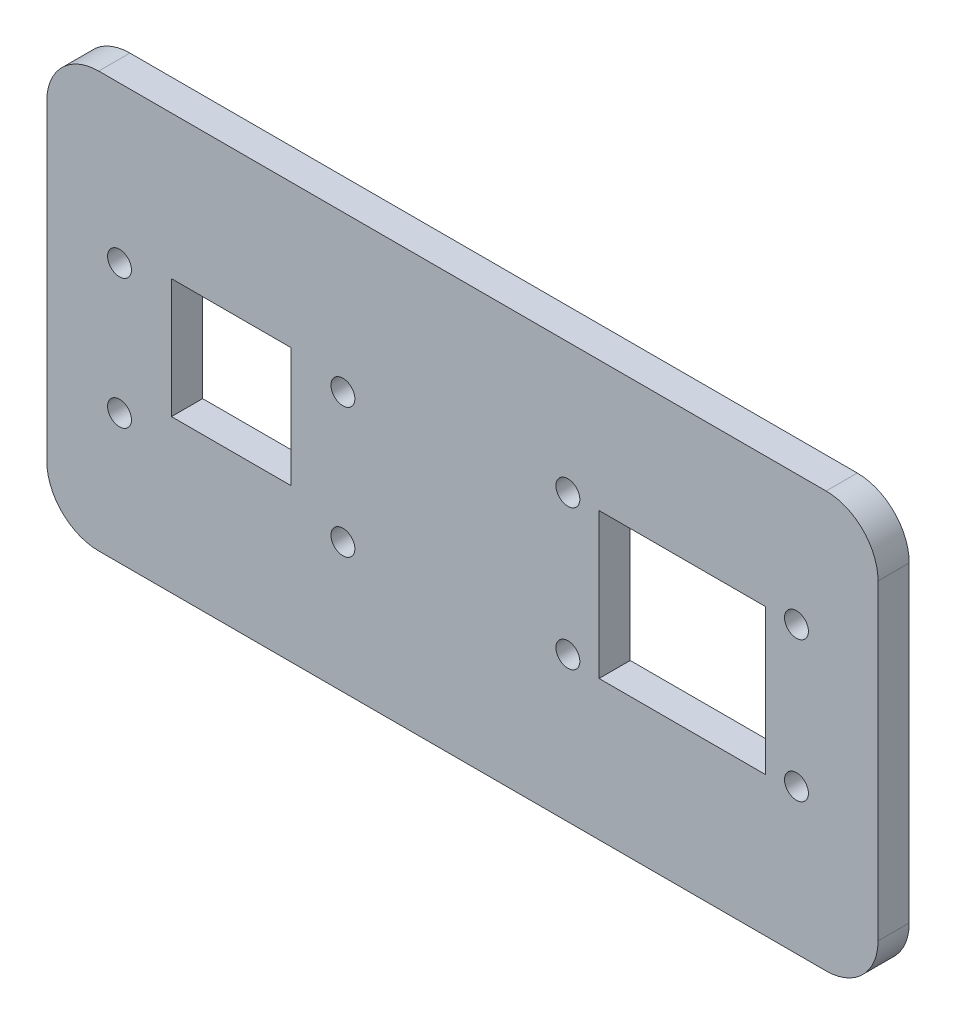
ISO-10303-21;
HEADER;
FILE_DESCRIPTION(('STEP AP214'),'2;1');
FILE_NAME('part.step','',(''),(''),'','','');
FILE_SCHEMA(('AUTOMOTIVE_DESIGN { 1 0 10303 214 1 1 1 1 }'));
ENDSEC;
DATA;
#1=APPLICATION_CONTEXT('core data for automotive mechanical design processes');
#2=APPLICATION_PROTOCOL_DEFINITION('international standard','automotive_design',2000,#1);
#3=PRODUCT_CONTEXT('',#1,'mechanical');
#4=PRODUCT('Part','Part','',(#3));
#5=PRODUCT_RELATED_PRODUCT_CATEGORY('part','',(#4));
#6=PRODUCT_DEFINITION_FORMATION('','',#4);
#7=PRODUCT_DEFINITION_CONTEXT('part definition',#1,'design');
#8=PRODUCT_DEFINITION('design','',#6,#7);
#9=PRODUCT_DEFINITION_SHAPE('','',#8);
#10=(LENGTH_UNIT() NAMED_UNIT(*) SI_UNIT(.MILLI.,.METRE.));
#11=(NAMED_UNIT(*) PLANE_ANGLE_UNIT() SI_UNIT($,.RADIAN.));
#12=(NAMED_UNIT(*) SI_UNIT($,.STERADIAN.) SOLID_ANGLE_UNIT());
#13=UNCERTAINTY_MEASURE_WITH_UNIT(LENGTH_MEASURE(1.E-05),#10,'distance_accuracy_value','');
#14=(GEOMETRIC_REPRESENTATION_CONTEXT(3) GLOBAL_UNCERTAINTY_ASSIGNED_CONTEXT((#13)) GLOBAL_UNIT_ASSIGNED_CONTEXT((#10,
#11,#12)) REPRESENTATION_CONTEXT('',''));
#15=CARTESIAN_POINT('',(0.,0.,0.));
#16=DIRECTION('',(0.,0.,1.));
#17=DIRECTION('',(1.,0.,0.));
#18=AXIS2_PLACEMENT_3D('',#15,#16,#17);
#19=CARTESIAN_POINT('',(0.,0.,3.));
#20=DIRECTION('',(0.,0.,1.));
#21=DIRECTION('',(1.,0.,0.));
#22=AXIS2_PLACEMENT_3D('',#19,#20,#21);
#23=PLANE('',#22);
#24=CARTESIAN_POINT('',(10.15,7.45000000000001,3.));
#25=DIRECTION('',(0.,0.,1.));
#26=DIRECTION('',(1.,0.,0.));
#27=AXIS2_PLACEMENT_3D('',#24,#25,#26);
#28=CIRCLE('',#27,1.15);
#29=CARTESIAN_POINT('',(11.3,7.45000000000001,3.));
#30=VERTEX_POINT('',#29);
#31=EDGE_CURVE('E598',#30,#30,#28,.T.);
#32=ORIENTED_EDGE('',*,*,#31,.F.);
#33=EDGE_LOOP('',(#32));
#34=FACE_BOUND('',#33,.T.);
#35=CARTESIAN_POINT('',(10.15,-6.04999999999999,3.));
#36=DIRECTION('',(0.,0.,1.));
#37=DIRECTION('',(1.,0.,0.));
#38=AXIS2_PLACEMENT_3D('',#35,#36,#37);
#39=CIRCLE('',#38,1.15);
#40=CARTESIAN_POINT('',(11.3,-6.04999999999999,3.));
#41=VERTEX_POINT('',#40);
#42=EDGE_CURVE('E606',#41,#41,#39,.T.);
#43=ORIENTED_EDGE('',*,*,#42,.F.);
#44=EDGE_LOOP('',(#43));
#45=FACE_BOUND('',#44,.T.);
#46=CARTESIAN_POINT('',(-33.,5.00000000000001,3.));
#47=DIRECTION('',(0.,0.,1.));
#48=DIRECTION('',(1.,0.,0.));
#49=AXIS2_PLACEMENT_3D('',#46,#47,#48);
#50=CIRCLE('',#49,1.15);
#51=CARTESIAN_POINT('',(-31.85,5.00000000000001,3.));
#52=VERTEX_POINT('',#51);
#53=EDGE_CURVE('E614',#52,#52,#50,.T.);
#54=ORIENTED_EDGE('',*,*,#53,.F.);
#55=EDGE_LOOP('',(#54));
#56=FACE_BOUND('',#55,.T.);
#57=CARTESIAN_POINT('',(-11.5,5.00000000000001,3.));
#58=DIRECTION('',(0.,0.,1.));
#59=DIRECTION('',(1.,0.,0.));
#60=AXIS2_PLACEMENT_3D('',#57,#58,#59);
#61=CIRCLE('',#60,1.15);
#62=CARTESIAN_POINT('',(-10.35,5.00000000000001,3.));
#63=VERTEX_POINT('',#62);
#64=EDGE_CURVE('E185',#63,#63,#61,.T.);
#65=ORIENTED_EDGE('',*,*,#64,.F.);
#66=EDGE_LOOP('',(#65));
#67=FACE_BOUND('',#66,.T.);
#68=DIRECTION('',(0.,1.,0.));
#69=VECTOR('',#68,1.);
#70=CARTESIAN_POINT('',(40.,20.,3.));
#71=LINE('',#70,#69);
#72=CARTESIAN_POINT('',(40.,-15.,3.));
#73=VERTEX_POINT('',#72);
#74=CARTESIAN_POINT('',(40.,15.,3.));
#75=VERTEX_POINT('',#74);
#76=EDGE_CURVE('E227',#73,#75,#71,.T.);
#77=ORIENTED_EDGE('',*,*,#76,.T.);
#78=CARTESIAN_POINT('',(35.,15.,3.));
#79=DIRECTION('',(0.,0.,1.));
#80=DIRECTION('',(1.,0.,0.));
#81=AXIS2_PLACEMENT_3D('',#78,#79,#80);
#82=CIRCLE('',#81,5.);
#83=CARTESIAN_POINT('',(35.,20.,3.));
#84=VERTEX_POINT('',#83);
#85=EDGE_CURVE('E270',#75,#84,#82,.T.);
#86=ORIENTED_EDGE('',*,*,#85,.T.);
#87=DIRECTION('',(-1.,0.,0.));
#88=VECTOR('',#87,1.);
#89=CARTESIAN_POINT('',(-40.,20.,3.));
#90=LINE('',#89,#88);
#91=CARTESIAN_POINT('',(-35.,20.,3.));
#92=VERTEX_POINT('',#91);
#93=EDGE_CURVE('E230',#84,#92,#90,.T.);
#94=ORIENTED_EDGE('',*,*,#93,.T.);
#95=CARTESIAN_POINT('',(-35.,15.,3.));
#96=DIRECTION('',(0.,0.,1.));
#97=DIRECTION('',(1.,0.,0.));
#98=AXIS2_PLACEMENT_3D('',#95,#96,#97);
#99=CIRCLE('',#98,5.);
#100=CARTESIAN_POINT('',(-40.,15.,3.));
#101=VERTEX_POINT('',#100);
#102=EDGE_CURVE('E265',#92,#101,#99,.T.);
#103=ORIENTED_EDGE('',*,*,#102,.T.);
#104=DIRECTION('',(0.,-1.,0.));
#105=VECTOR('',#104,1.);
#106=CARTESIAN_POINT('',(-40.,20.,3.));
#107=LINE('',#106,#105);
#108=CARTESIAN_POINT('',(-40.,-15.,3.));
#109=VERTEX_POINT('',#108);
#110=EDGE_CURVE('E234',#101,#109,#107,.T.);
#111=ORIENTED_EDGE('',*,*,#110,.T.);
#112=CARTESIAN_POINT('',(-35.,-15.,3.));
#113=DIRECTION('',(0.,0.,1.));
#114=DIRECTION('',(1.,0.,0.));
#115=AXIS2_PLACEMENT_3D('',#112,#113,#114);
#116=CIRCLE('',#115,5.);
#117=CARTESIAN_POINT('',(-35.,-20.,3.));
#118=VERTEX_POINT('',#117);
#119=EDGE_CURVE('E59',#109,#118,#116,.T.);
#120=ORIENTED_EDGE('',*,*,#119,.T.);
#121=DIRECTION('',(1.,0.,0.));
#122=VECTOR('',#121,1.);
#123=CARTESIAN_POINT('',(-40.,-20.,3.));
#124=LINE('',#123,#122);
#125=CARTESIAN_POINT('',(35.,-20.,3.));
#126=VERTEX_POINT('',#125);
#127=EDGE_CURVE('E236',#118,#126,#124,.T.);
#128=ORIENTED_EDGE('',*,*,#127,.T.);
#129=CARTESIAN_POINT('',(35.,-15.,3.));
#130=DIRECTION('',(0.,0.,1.));
#131=DIRECTION('',(1.,0.,0.));
#132=AXIS2_PLACEMENT_3D('',#129,#130,#131);
#133=CIRCLE('',#132,5.);
#134=EDGE_CURVE('E268',#126,#73,#133,.T.);
#135=ORIENTED_EDGE('',*,*,#134,.T.);
#136=EDGE_LOOP('',(#77,#86,#94,#103,#111,#120,#128,#135));
#137=FACE_BOUND('',#136,.T.);
#138=DIRECTION('',(-1.,0.,0.));
#139=VECTOR('',#138,1.);
#140=CARTESIAN_POINT('',(-28.,6.20000000000001,3.));
#141=LINE('',#140,#139);
#142=CARTESIAN_POINT('',(-16.5,6.20000000000001,3.));
#143=VERTEX_POINT('',#142);
#144=CARTESIAN_POINT('',(-28.,6.20000000000001,3.));
#145=VERTEX_POINT('',#144);
#146=EDGE_CURVE('E198',#143,#145,#141,.T.);
#147=ORIENTED_EDGE('',*,*,#146,.F.);
#148=DIRECTION('',(0.,1.,0.));
#149=VECTOR('',#148,1.);
#150=CARTESIAN_POINT('',(-16.5,6.20000000000001,3.));
#151=LINE('',#150,#149);
#152=CARTESIAN_POINT('',(-16.5,-5.29999999999999,3.));
#153=VERTEX_POINT('',#152);
#154=EDGE_CURVE('E196',#153,#143,#151,.T.);
#155=ORIENTED_EDGE('',*,*,#154,.F.);
#156=DIRECTION('',(1.,0.,0.));
#157=VECTOR('',#156,1.);
#158=CARTESIAN_POINT('',(-28.,-5.29999999999999,3.));
#159=LINE('',#158,#157);
#160=CARTESIAN_POINT('',(-28.,-5.29999999999999,3.));
#161=VERTEX_POINT('',#160);
#162=EDGE_CURVE('E204',#161,#153,#159,.T.);
#163=ORIENTED_EDGE('',*,*,#162,.F.);
#164=DIRECTION('',(0.,-1.,0.));
#165=VECTOR('',#164,1.);
#166=CARTESIAN_POINT('',(-28.,6.20000000000001,3.));
#167=LINE('',#166,#165);
#168=EDGE_CURVE('E201',#145,#161,#167,.T.);
#169=ORIENTED_EDGE('',*,*,#168,.F.);
#170=EDGE_LOOP('',(#147,#155,#163,#169));
#171=FACE_BOUND('',#170,.T.);
#172=DIRECTION('',(-1.,0.,0.));
#173=VECTOR('',#172,1.);
#174=CARTESIAN_POINT('',(13.15,7.45000000000001,3.));
#175=LINE('',#174,#173);
#176=CARTESIAN_POINT('',(29.15,7.45000000000001,3.));
#177=VERTEX_POINT('',#176);
#178=CARTESIAN_POINT('',(13.15,7.45000000000001,3.));
#179=VERTEX_POINT('',#178);
#180=EDGE_CURVE('E162',#177,#179,#175,.T.);
#181=ORIENTED_EDGE('',*,*,#180,.F.);
#182=DIRECTION('',(0.,1.,0.));
#183=VECTOR('',#182,1.);
#184=CARTESIAN_POINT('',(29.15,7.45000000000001,3.));
#185=LINE('',#184,#183);
#186=CARTESIAN_POINT('',(29.15,-6.54999999999999,3.));
#187=VERTEX_POINT('',#186);
#188=EDGE_CURVE('E152',#187,#177,#185,.T.);
#189=ORIENTED_EDGE('',*,*,#188,.F.);
#190=DIRECTION('',(1.,0.,0.));
#191=VECTOR('',#190,1.);
#192=CARTESIAN_POINT('',(13.15,-6.54999999999999,3.));
#193=LINE('',#192,#191);
#194=CARTESIAN_POINT('',(13.15,-6.54999999999999,3.));
#195=VERTEX_POINT('',#194);
#196=EDGE_CURVE('E178',#195,#187,#193,.T.);
#197=ORIENTED_EDGE('',*,*,#196,.F.);
#198=DIRECTION('',(0.,-1.,0.));
#199=VECTOR('',#198,1.);
#200=CARTESIAN_POINT('',(13.15,7.45000000000001,3.));
#201=LINE('',#200,#199);
#202=EDGE_CURVE('E176',#179,#195,#201,.T.);
#203=ORIENTED_EDGE('',*,*,#202,.F.);
#204=EDGE_LOOP('',(#181,#189,#197,#203));
#205=FACE_BOUND('',#204,.T.);
#206=CARTESIAN_POINT('',(-11.5,-7.49999999999999,3.));
#207=DIRECTION('',(0.,0.,1.));
#208=DIRECTION('',(1.,0.,0.));
#209=AXIS2_PLACEMENT_3D('',#206,#207,#208);
#210=CIRCLE('',#209,1.15);
#211=CARTESIAN_POINT('',(-10.35,-7.49999999999999,3.));
#212=VERTEX_POINT('',#211);
#213=EDGE_CURVE('E618',#212,#212,#210,.T.);
#214=ORIENTED_EDGE('',*,*,#213,.F.);
#215=EDGE_LOOP('',(#214));
#216=FACE_BOUND('',#215,.T.);
#217=CARTESIAN_POINT('',(-33.,-7.49999999999999,3.));
#218=DIRECTION('',(0.,0.,1.));
#219=DIRECTION('',(1.,0.,0.));
#220=AXIS2_PLACEMENT_3D('',#217,#218,#219);
#221=CIRCLE('',#220,1.15);
#222=CARTESIAN_POINT('',(-31.85,-7.49999999999999,3.));
#223=VERTEX_POINT('',#222);
#224=EDGE_CURVE('E610',#223,#223,#221,.T.);
#225=ORIENTED_EDGE('',*,*,#224,.F.);
#226=EDGE_LOOP('',(#225));
#227=FACE_BOUND('',#226,.T.);
#228=CARTESIAN_POINT('',(32.15,7.45000000000001,3.));
#229=DIRECTION('',(0.,0.,1.));
#230=DIRECTION('',(1.,0.,0.));
#231=AXIS2_PLACEMENT_3D('',#228,#229,#230);
#232=CIRCLE('',#231,1.15);
#233=CARTESIAN_POINT('',(33.3,7.45000000000001,3.));
#234=VERTEX_POINT('',#233);
#235=EDGE_CURVE('E602',#234,#234,#232,.T.);
#236=ORIENTED_EDGE('',*,*,#235,.F.);
#237=EDGE_LOOP('',(#236));
#238=FACE_BOUND('',#237,.T.);
#239=CARTESIAN_POINT('',(32.15,-6.04999999999999,3.));
#240=DIRECTION('',(0.,0.,1.));
#241=DIRECTION('',(1.,0.,0.));
#242=AXIS2_PLACEMENT_3D('',#239,#240,#241);
#243=CIRCLE('',#242,1.15);
#244=CARTESIAN_POINT('',(33.3,-6.04999999999999,3.));
#245=VERTEX_POINT('',#244);
#246=EDGE_CURVE('E593',#245,#245,#243,.T.);
#247=ORIENTED_EDGE('',*,*,#246,.F.);
#248=EDGE_LOOP('',(#247));
#249=FACE_BOUND('',#248,.T.);
#250=ADVANCED_FACE('F37',(#34,#45,#56,#67,#137,#171,#205,#216,#227,#238,#249),#23,.T.);
#251=CARTESIAN_POINT('',(0.,0.,0.));
#252=DIRECTION('',(0.,0.,1.));
#253=DIRECTION('',(1.,0.,0.));
#254=AXIS2_PLACEMENT_3D('',#251,#252,#253);
#255=PLANE('',#254);
#256=DIRECTION('',(0.,1.,0.));
#257=VECTOR('',#256,1.);
#258=CARTESIAN_POINT('',(-16.5,6.20000000000001,0.));
#259=LINE('',#258,#257);
#260=CARTESIAN_POINT('',(-16.5,-5.29999999999999,0.));
#261=VERTEX_POINT('',#260);
#262=CARTESIAN_POINT('',(-16.5,6.20000000000001,0.));
#263=VERTEX_POINT('',#262);
#264=EDGE_CURVE('E170',#261,#263,#259,.T.);
#265=ORIENTED_EDGE('',*,*,#264,.T.);
#266=DIRECTION('',(-1.,0.,0.));
#267=VECTOR('',#266,1.);
#268=CARTESIAN_POINT('',(-28.,6.20000000000001,0.));
#269=LINE('',#268,#267);
#270=CARTESIAN_POINT('',(-28.,6.20000000000001,0.));
#271=VERTEX_POINT('',#270);
#272=EDGE_CURVE('E209',#263,#271,#269,.T.);
#273=ORIENTED_EDGE('',*,*,#272,.T.);
#274=DIRECTION('',(0.,-1.,0.));
#275=VECTOR('',#274,1.);
#276=CARTESIAN_POINT('',(-28.,6.20000000000001,0.));
#277=LINE('',#276,#275);
#278=CARTESIAN_POINT('',(-28.,-5.29999999999999,0.));
#279=VERTEX_POINT('',#278);
#280=EDGE_CURVE('E212',#271,#279,#277,.T.);
#281=ORIENTED_EDGE('',*,*,#280,.T.);
#282=DIRECTION('',(1.,0.,0.));
#283=VECTOR('',#282,1.);
#284=CARTESIAN_POINT('',(-28.,-5.29999999999999,0.));
#285=LINE('',#284,#283);
#286=EDGE_CURVE('E199',#279,#261,#285,.T.);
#287=ORIENTED_EDGE('',*,*,#286,.T.);
#288=EDGE_LOOP('',(#265,#273,#281,#287));
#289=FACE_BOUND('',#288,.T.);
#290=DIRECTION('',(-1.,0.,0.));
#291=VECTOR('',#290,1.);
#292=CARTESIAN_POINT('',(-40.,20.,0.));
#293=LINE('',#292,#291);
#294=CARTESIAN_POINT('',(35.,20.,0.));
#295=VERTEX_POINT('',#294);
#296=CARTESIAN_POINT('',(-35.,20.,0.));
#297=VERTEX_POINT('',#296);
#298=EDGE_CURVE('E241',#295,#297,#293,.T.);
#299=ORIENTED_EDGE('',*,*,#298,.F.);
#300=CARTESIAN_POINT('',(35.,15.,0.));
#301=DIRECTION('',(0.,0.,1.));
#302=DIRECTION('',(1.,0.,0.));
#303=AXIS2_PLACEMENT_3D('',#300,#301,#302);
#304=CIRCLE('',#303,5.);
#305=CARTESIAN_POINT('',(40.,15.,0.));
#306=VERTEX_POINT('',#305);
#307=EDGE_CURVE('E258',#295,#306,#304,.F.);
#308=ORIENTED_EDGE('',*,*,#307,.T.);
#309=DIRECTION('',(0.,1.,0.));
#310=VECTOR('',#309,1.);
#311=CARTESIAN_POINT('',(40.,20.,0.));
#312=LINE('',#311,#310);
#313=CARTESIAN_POINT('',(40.,-15.,0.));
#314=VERTEX_POINT('',#313);
#315=EDGE_CURVE('E226',#314,#306,#312,.T.);
#316=ORIENTED_EDGE('',*,*,#315,.F.);
#317=CARTESIAN_POINT('',(35.,-15.,0.));
#318=DIRECTION('',(0.,0.,1.));
#319=DIRECTION('',(1.,0.,0.));
#320=AXIS2_PLACEMENT_3D('',#317,#318,#319);
#321=CIRCLE('',#320,5.);
#322=CARTESIAN_POINT('',(35.,-20.,0.));
#323=VERTEX_POINT('',#322);
#324=EDGE_CURVE('E256',#314,#323,#321,.F.);
#325=ORIENTED_EDGE('',*,*,#324,.T.);
#326=DIRECTION('',(1.,0.,0.));
#327=VECTOR('',#326,1.);
#328=CARTESIAN_POINT('',(-40.,-20.,0.));
#329=LINE('',#328,#327);
#330=CARTESIAN_POINT('',(-35.,-20.,0.));
#331=VERTEX_POINT('',#330);
#332=EDGE_CURVE('E231',#331,#323,#329,.T.);
#333=ORIENTED_EDGE('',*,*,#332,.F.);
#334=CARTESIAN_POINT('',(-35.,-15.,0.));
#335=DIRECTION('',(0.,0.,1.));
#336=DIRECTION('',(1.,0.,0.));
#337=AXIS2_PLACEMENT_3D('',#334,#335,#336);
#338=CIRCLE('',#337,5.);
#339=CARTESIAN_POINT('',(-40.,-15.,0.));
#340=VERTEX_POINT('',#339);
#341=EDGE_CURVE('E254',#331,#340,#338,.F.);
#342=ORIENTED_EDGE('',*,*,#341,.T.);
#343=DIRECTION('',(0.,-1.,0.));
#344=VECTOR('',#343,1.);
#345=CARTESIAN_POINT('',(-40.,20.,0.));
#346=LINE('',#345,#344);
#347=CARTESIAN_POINT('',(-40.,15.,0.));
#348=VERTEX_POINT('',#347);
#349=EDGE_CURVE('E244',#348,#340,#346,.T.);
#350=ORIENTED_EDGE('',*,*,#349,.F.);
#351=CARTESIAN_POINT('',(-35.,15.,0.));
#352=DIRECTION('',(0.,0.,1.));
#353=DIRECTION('',(1.,0.,0.));
#354=AXIS2_PLACEMENT_3D('',#351,#352,#353);
#355=CIRCLE('',#354,5.);
#356=EDGE_CURVE('E252',#348,#297,#355,.F.);
#357=ORIENTED_EDGE('',*,*,#356,.T.);
#358=EDGE_LOOP('',(#299,#308,#316,#325,#333,#342,#350,#357));
#359=FACE_BOUND('',#358,.T.);
#360=DIRECTION('',(0.,1.,0.));
#361=VECTOR('',#360,1.);
#362=CARTESIAN_POINT('',(29.15,7.45000000000001,0.));
#363=LINE('',#362,#361);
#364=CARTESIAN_POINT('',(29.15,-6.54999999999999,0.));
#365=VERTEX_POINT('',#364);
#366=CARTESIAN_POINT('',(29.15,7.45000000000001,0.));
#367=VERTEX_POINT('',#366);
#368=EDGE_CURVE('E183',#365,#367,#363,.T.);
#369=ORIENTED_EDGE('',*,*,#368,.T.);
#370=DIRECTION('',(-1.,0.,0.));
#371=VECTOR('',#370,1.);
#372=CARTESIAN_POINT('',(13.15,7.45000000000001,0.));
#373=LINE('',#372,#371);
#374=CARTESIAN_POINT('',(13.15,7.45000000000001,0.));
#375=VERTEX_POINT('',#374);
#376=EDGE_CURVE('E169',#367,#375,#373,.T.);
#377=ORIENTED_EDGE('',*,*,#376,.T.);
#378=DIRECTION('',(0.,-1.,0.));
#379=VECTOR('',#378,1.);
#380=CARTESIAN_POINT('',(13.15,7.45000000000001,0.));
#381=LINE('',#380,#379);
#382=CARTESIAN_POINT('',(13.15,-6.54999999999999,0.));
#383=VERTEX_POINT('',#382);
#384=EDGE_CURVE('E187',#375,#383,#381,.T.);
#385=ORIENTED_EDGE('',*,*,#384,.T.);
#386=DIRECTION('',(1.,0.,0.));
#387=VECTOR('',#386,1.);
#388=CARTESIAN_POINT('',(13.15,-6.54999999999999,0.));
#389=LINE('',#388,#387);
#390=EDGE_CURVE('E163',#383,#365,#389,.T.);
#391=ORIENTED_EDGE('',*,*,#390,.T.);
#392=EDGE_LOOP('',(#369,#377,#385,#391));
#393=FACE_BOUND('',#392,.T.);
#394=CARTESIAN_POINT('',(-11.5,5.00000000000001,0.));
#395=DIRECTION('',(0.,0.,1.));
#396=DIRECTION('',(1.,0.,0.));
#397=AXIS2_PLACEMENT_3D('',#394,#395,#396);
#398=CIRCLE('',#397,1.15);
#399=CARTESIAN_POINT('',(-10.35,5.00000000000001,0.));
#400=VERTEX_POINT('',#399);
#401=EDGE_CURVE('E564',#400,#400,#398,.T.);
#402=ORIENTED_EDGE('',*,*,#401,.T.);
#403=EDGE_LOOP('',(#402));
#404=FACE_BOUND('',#403,.T.);
#405=CARTESIAN_POINT('',(-11.5,-7.49999999999999,0.));
#406=DIRECTION('',(0.,0.,1.));
#407=DIRECTION('',(1.,0.,0.));
#408=AXIS2_PLACEMENT_3D('',#405,#406,#407);
#409=CIRCLE('',#408,1.15);
#410=CARTESIAN_POINT('',(-10.35,-7.49999999999999,0.));
#411=VERTEX_POINT('',#410);
#412=EDGE_CURVE('E568',#411,#411,#409,.T.);
#413=ORIENTED_EDGE('',*,*,#412,.T.);
#414=EDGE_LOOP('',(#413));
#415=FACE_BOUND('',#414,.T.);
#416=CARTESIAN_POINT('',(-33.,5.00000000000001,0.));
#417=DIRECTION('',(0.,0.,1.));
#418=DIRECTION('',(1.,0.,0.));
#419=AXIS2_PLACEMENT_3D('',#416,#417,#418);
#420=CIRCLE('',#419,1.15);
#421=CARTESIAN_POINT('',(-31.85,5.00000000000001,0.));
#422=VERTEX_POINT('',#421);
#423=EDGE_CURVE('E572',#422,#422,#420,.T.);
#424=ORIENTED_EDGE('',*,*,#423,.T.);
#425=EDGE_LOOP('',(#424));
#426=FACE_BOUND('',#425,.T.);
#427=CARTESIAN_POINT('',(-33.,-7.49999999999999,0.));
#428=DIRECTION('',(0.,0.,1.));
#429=DIRECTION('',(1.,0.,0.));
#430=AXIS2_PLACEMENT_3D('',#427,#428,#429);
#431=CIRCLE('',#430,1.15);
#432=CARTESIAN_POINT('',(-31.85,-7.49999999999999,0.));
#433=VERTEX_POINT('',#432);
#434=EDGE_CURVE('E576',#433,#433,#431,.T.);
#435=ORIENTED_EDGE('',*,*,#434,.T.);
#436=EDGE_LOOP('',(#435));
#437=FACE_BOUND('',#436,.T.);
#438=CARTESIAN_POINT('',(10.15,-6.04999999999999,0.));
#439=DIRECTION('',(0.,0.,1.));
#440=DIRECTION('',(1.,0.,0.));
#441=AXIS2_PLACEMENT_3D('',#438,#439,#440);
#442=CIRCLE('',#441,1.15);
#443=CARTESIAN_POINT('',(11.3,-6.04999999999999,0.));
#444=VERTEX_POINT('',#443);
#445=EDGE_CURVE('E580',#444,#444,#442,.T.);
#446=ORIENTED_EDGE('',*,*,#445,.T.);
#447=EDGE_LOOP('',(#446));
#448=FACE_BOUND('',#447,.T.);
#449=CARTESIAN_POINT('',(32.15,7.45000000000001,0.));
#450=DIRECTION('',(0.,0.,1.));
#451=DIRECTION('',(1.,0.,0.));
#452=AXIS2_PLACEMENT_3D('',#449,#450,#451);
#453=CIRCLE('',#452,1.15);
#454=CARTESIAN_POINT('',(33.3,7.45000000000001,0.));
#455=VERTEX_POINT('',#454);
#456=EDGE_CURVE('E584',#455,#455,#453,.T.);
#457=ORIENTED_EDGE('',*,*,#456,.T.);
#458=EDGE_LOOP('',(#457));
#459=FACE_BOUND('',#458,.T.);
#460=CARTESIAN_POINT('',(10.15,7.45000000000001,0.));
#461=DIRECTION('',(0.,0.,1.));
#462=DIRECTION('',(1.,0.,0.));
#463=AXIS2_PLACEMENT_3D('',#460,#461,#462);
#464=CIRCLE('',#463,1.15);
#465=CARTESIAN_POINT('',(11.3,7.45000000000001,0.));
#466=VERTEX_POINT('',#465);
#467=EDGE_CURVE('E588',#466,#466,#464,.T.);
#468=ORIENTED_EDGE('',*,*,#467,.T.);
#469=EDGE_LOOP('',(#468));
#470=FACE_BOUND('',#469,.T.);
#471=CARTESIAN_POINT('',(32.15,-6.04999999999999,0.));
#472=DIRECTION('',(0.,0.,1.));
#473=DIRECTION('',(1.,0.,0.));
#474=AXIS2_PLACEMENT_3D('',#471,#472,#473);
#475=CIRCLE('',#474,1.15);
#476=CARTESIAN_POINT('',(33.3,-6.04999999999999,0.));
#477=VERTEX_POINT('',#476);
#478=EDGE_CURVE('E591',#477,#477,#475,.T.);
#479=ORIENTED_EDGE('',*,*,#478,.T.);
#480=EDGE_LOOP('',(#479));
#481=FACE_BOUND('',#480,.T.);
#482=ADVANCED_FACE('F286',(#289,#359,#393,#404,#415,#426,#437,#448,#459,#470,#481),#255,.F.);
#483=CARTESIAN_POINT('',(40.,20.,3.));
#484=DIRECTION('',(-1.,0.,0.));
#485=DIRECTION('',(0.,-1.,0.));
#486=AXIS2_PLACEMENT_3D('',#483,#484,#485);
#487=PLANE('',#486);
#488=ORIENTED_EDGE('',*,*,#315,.T.);
#489=DIRECTION('',(0.,0.,-1.));
#490=VECTOR('',#489,1.);
#491=CARTESIAN_POINT('',(40.,15.,3.));
#492=LINE('',#491,#490);
#493=EDGE_CURVE('E263',#306,#75,#492,.F.);
#494=ORIENTED_EDGE('',*,*,#493,.T.);
#495=ORIENTED_EDGE('',*,*,#76,.F.);
#496=DIRECTION('',(0.,0.,-1.));
#497=VECTOR('',#496,1.);
#498=CARTESIAN_POINT('',(40.,-15.,3.));
#499=LINE('',#498,#497);
#500=EDGE_CURVE('E260',#73,#314,#499,.T.);
#501=ORIENTED_EDGE('',*,*,#500,.T.);
#502=EDGE_LOOP('',(#488,#494,#495,#501));
#503=FACE_BOUND('',#502,.T.);
#504=ADVANCED_FACE('F301',(#503),#487,.F.);
#505=CARTESIAN_POINT('',(-40.,20.,3.));
#506=DIRECTION('',(0.,-1.,0.));
#507=DIRECTION('',(0.,0.,-1.));
#508=AXIS2_PLACEMENT_3D('',#505,#506,#507);
#509=PLANE('',#508);
#510=ORIENTED_EDGE('',*,*,#93,.F.);
#511=DIRECTION('',(0.,0.,-1.));
#512=VECTOR('',#511,1.);
#513=CARTESIAN_POINT('',(35.,20.,3.));
#514=LINE('',#513,#512);
#515=EDGE_CURVE('E249',#84,#295,#514,.T.);
#516=ORIENTED_EDGE('',*,*,#515,.T.);
#517=ORIENTED_EDGE('',*,*,#298,.T.);
#518=DIRECTION('',(0.,0.,-1.));
#519=VECTOR('',#518,1.);
#520=CARTESIAN_POINT('',(-35.,20.,3.));
#521=LINE('',#520,#519);
#522=EDGE_CURVE('E238',#297,#92,#521,.F.);
#523=ORIENTED_EDGE('',*,*,#522,.T.);
#524=EDGE_LOOP('',(#510,#516,#517,#523));
#525=FACE_BOUND('',#524,.T.);
#526=ADVANCED_FACE('F309',(#525),#509,.F.);
#527=CARTESIAN_POINT('',(-40.,20.,3.));
#528=DIRECTION('',(1.,0.,0.));
#529=DIRECTION('',(0.,1.,0.));
#530=AXIS2_PLACEMENT_3D('',#527,#528,#529);
#531=PLANE('',#530);
#532=ORIENTED_EDGE('',*,*,#349,.T.);
#533=DIRECTION('',(0.,0.,-1.));
#534=VECTOR('',#533,1.);
#535=CARTESIAN_POINT('',(-40.,-15.,3.));
#536=LINE('',#535,#534);
#537=EDGE_CURVE('E11',#340,#109,#536,.F.);
#538=ORIENTED_EDGE('',*,*,#537,.T.);
#539=ORIENTED_EDGE('',*,*,#110,.F.);
#540=DIRECTION('',(0.,0.,-1.));
#541=VECTOR('',#540,1.);
#542=CARTESIAN_POINT('',(-40.,15.,3.));
#543=LINE('',#542,#541);
#544=EDGE_CURVE('E45',#101,#348,#543,.T.);
#545=ORIENTED_EDGE('',*,*,#544,.T.);
#546=EDGE_LOOP('',(#532,#538,#539,#545));
#547=FACE_BOUND('',#546,.T.);
#548=ADVANCED_FACE('F280',(#547),#531,.F.);
#549=CARTESIAN_POINT('',(-40.,-20.,3.));
#550=DIRECTION('',(0.,1.,0.));
#551=DIRECTION('',(0.,0.,1.));
#552=AXIS2_PLACEMENT_3D('',#549,#550,#551);
#553=PLANE('',#552);
#554=ORIENTED_EDGE('',*,*,#332,.T.);
#555=DIRECTION('',(0.,0.,-1.));
#556=VECTOR('',#555,1.);
#557=CARTESIAN_POINT('',(35.,-20.,3.));
#558=LINE('',#557,#556);
#559=EDGE_CURVE('E52',#323,#126,#558,.F.);
#560=ORIENTED_EDGE('',*,*,#559,.T.);
#561=ORIENTED_EDGE('',*,*,#127,.F.);
#562=DIRECTION('',(0.,0.,-1.));
#563=VECTOR('',#562,1.);
#564=CARTESIAN_POINT('',(-35.,-20.,3.));
#565=LINE('',#564,#563);
#566=EDGE_CURVE('E272',#118,#331,#565,.T.);
#567=ORIENTED_EDGE('',*,*,#566,.T.);
#568=EDGE_LOOP('',(#554,#560,#561,#567));
#569=FACE_BOUND('',#568,.T.);
#570=ADVANCED_FACE('F292',(#569),#553,.F.);
#571=CARTESIAN_POINT('',(-16.5,6.20000000000001,3.));
#572=DIRECTION('',(-1.,0.,0.));
#573=DIRECTION('',(0.,0.,1.));
#574=AXIS2_PLACEMENT_3D('',#571,#572,#573);
#575=PLANE('',#574);
#576=ORIENTED_EDGE('',*,*,#264,.F.);
#577=DIRECTION('',(0.,0.,-1.));
#578=VECTOR('',#577,1.);
#579=CARTESIAN_POINT('',(-16.5,-5.29999999999999,3.));
#580=LINE('',#579,#578);
#581=EDGE_CURVE('E206',#153,#261,#580,.T.);
#582=ORIENTED_EDGE('',*,*,#581,.F.);
#583=ORIENTED_EDGE('',*,*,#154,.T.);
#584=DIRECTION('',(0.,0.,-1.));
#585=VECTOR('',#584,1.);
#586=CARTESIAN_POINT('',(-16.5,6.20000000000001,3.));
#587=LINE('',#586,#585);
#588=EDGE_CURVE('E223',#143,#263,#587,.T.);
#589=ORIENTED_EDGE('',*,*,#588,.T.);
#590=EDGE_LOOP('',(#576,#582,#583,#589));
#591=FACE_BOUND('',#590,.T.);
#592=ADVANCED_FACE('F326',(#591),#575,.T.);
#593=CARTESIAN_POINT('',(-28.,6.20000000000001,3.));
#594=DIRECTION('',(0.,-1.,0.));
#595=DIRECTION('',(0.,0.,-1.));
#596=AXIS2_PLACEMENT_3D('',#593,#594,#595);
#597=PLANE('',#596);
#598=ORIENTED_EDGE('',*,*,#272,.F.);
#599=ORIENTED_EDGE('',*,*,#588,.F.);
#600=ORIENTED_EDGE('',*,*,#146,.T.);
#601=DIRECTION('',(0.,0.,-1.));
#602=VECTOR('',#601,1.);
#603=CARTESIAN_POINT('',(-28.,6.20000000000001,3.));
#604=LINE('',#603,#602);
#605=EDGE_CURVE('E221',#145,#271,#604,.T.);
#606=ORIENTED_EDGE('',*,*,#605,.T.);
#607=EDGE_LOOP('',(#598,#599,#600,#606));
#608=FACE_BOUND('',#607,.T.);
#609=ADVANCED_FACE('F483',(#608),#597,.T.);
#610=CARTESIAN_POINT('',(-28.,6.20000000000001,3.));
#611=DIRECTION('',(1.,0.,0.));
#612=DIRECTION('',(0.,1.,0.));
#613=AXIS2_PLACEMENT_3D('',#610,#611,#612);
#614=PLANE('',#613);
#615=ORIENTED_EDGE('',*,*,#280,.F.);
#616=ORIENTED_EDGE('',*,*,#605,.F.);
#617=ORIENTED_EDGE('',*,*,#168,.T.);
#618=DIRECTION('',(0.,0.,-1.));
#619=VECTOR('',#618,1.);
#620=CARTESIAN_POINT('',(-28.,-5.29999999999999,3.));
#621=LINE('',#620,#619);
#622=EDGE_CURVE('E219',#161,#279,#621,.T.);
#623=ORIENTED_EDGE('',*,*,#622,.T.);
#624=EDGE_LOOP('',(#615,#616,#617,#623));
#625=FACE_BOUND('',#624,.T.);
#626=ADVANCED_FACE('F474',(#625),#614,.T.);
#627=CARTESIAN_POINT('',(-28.,-5.29999999999999,3.));
#628=DIRECTION('',(0.,1.,0.));
#629=DIRECTION('',(0.,0.,1.));
#630=AXIS2_PLACEMENT_3D('',#627,#628,#629);
#631=PLANE('',#630);
#632=ORIENTED_EDGE('',*,*,#286,.F.);
#633=ORIENTED_EDGE('',*,*,#622,.F.);
#634=ORIENTED_EDGE('',*,*,#162,.T.);
#635=ORIENTED_EDGE('',*,*,#581,.T.);
#636=EDGE_LOOP('',(#632,#633,#634,#635));
#637=FACE_BOUND('',#636,.T.);
#638=ADVANCED_FACE('F466',(#637),#631,.T.);
#639=CARTESIAN_POINT('',(29.15,7.45000000000001,3.));
#640=DIRECTION('',(-1.,0.,0.));
#641=DIRECTION('',(0.,0.,1.));
#642=AXIS2_PLACEMENT_3D('',#639,#640,#641);
#643=PLANE('',#642);
#644=ORIENTED_EDGE('',*,*,#368,.F.);
#645=DIRECTION('',(0.,0.,-1.));
#646=VECTOR('',#645,1.);
#647=CARTESIAN_POINT('',(29.15,-6.54999999999999,3.));
#648=LINE('',#647,#646);
#649=EDGE_CURVE('E158',#187,#365,#648,.T.);
#650=ORIENTED_EDGE('',*,*,#649,.F.);
#651=ORIENTED_EDGE('',*,*,#188,.T.);
#652=DIRECTION('',(0.,0.,-1.));
#653=VECTOR('',#652,1.);
#654=CARTESIAN_POINT('',(29.15,7.45000000000001,3.));
#655=LINE('',#654,#653);
#656=EDGE_CURVE('E155',#177,#367,#655,.T.);
#657=ORIENTED_EDGE('',*,*,#656,.T.);
#658=EDGE_LOOP('',(#644,#650,#651,#657));
#659=FACE_BOUND('',#658,.T.);
#660=ADVANCED_FACE('F154',(#659),#643,.T.);
#661=CARTESIAN_POINT('',(13.15,7.45000000000001,3.));
#662=DIRECTION('',(0.,-1.,0.));
#663=DIRECTION('',(0.,0.,-1.));
#664=AXIS2_PLACEMENT_3D('',#661,#662,#663);
#665=PLANE('',#664);
#666=ORIENTED_EDGE('',*,*,#376,.F.);
#667=ORIENTED_EDGE('',*,*,#656,.F.);
#668=ORIENTED_EDGE('',*,*,#180,.T.);
#669=DIRECTION('',(0.,0.,-1.));
#670=VECTOR('',#669,1.);
#671=CARTESIAN_POINT('',(13.15,7.45000000000001,3.));
#672=LINE('',#671,#670);
#673=EDGE_CURVE('E171',#179,#375,#672,.T.);
#674=ORIENTED_EDGE('',*,*,#673,.T.);
#675=EDGE_LOOP('',(#666,#667,#668,#674));
#676=FACE_BOUND('',#675,.T.);
#677=ADVANCED_FACE('F166',(#676),#665,.T.);
#678=CARTESIAN_POINT('',(13.15,7.45000000000001,3.));
#679=DIRECTION('',(1.,0.,0.));
#680=DIRECTION('',(0.,1.,0.));
#681=AXIS2_PLACEMENT_3D('',#678,#679,#680);
#682=PLANE('',#681);
#683=ORIENTED_EDGE('',*,*,#384,.F.);
#684=ORIENTED_EDGE('',*,*,#673,.F.);
#685=ORIENTED_EDGE('',*,*,#202,.T.);
#686=DIRECTION('',(0.,0.,-1.));
#687=VECTOR('',#686,1.);
#688=CARTESIAN_POINT('',(13.15,-6.54999999999999,3.));
#689=LINE('',#688,#687);
#690=EDGE_CURVE('E193',#195,#383,#689,.T.);
#691=ORIENTED_EDGE('',*,*,#690,.T.);
#692=EDGE_LOOP('',(#683,#684,#685,#691));
#693=FACE_BOUND('',#692,.T.);
#694=ADVANCED_FACE('F442',(#693),#682,.T.);
#695=CARTESIAN_POINT('',(13.15,-6.54999999999999,3.));
#696=DIRECTION('',(0.,1.,0.));
#697=DIRECTION('',(0.,0.,1.));
#698=AXIS2_PLACEMENT_3D('',#695,#696,#697);
#699=PLANE('',#698);
#700=ORIENTED_EDGE('',*,*,#390,.F.);
#701=ORIENTED_EDGE('',*,*,#690,.F.);
#702=ORIENTED_EDGE('',*,*,#196,.T.);
#703=ORIENTED_EDGE('',*,*,#649,.T.);
#704=EDGE_LOOP('',(#700,#701,#702,#703));
#705=FACE_BOUND('',#704,.T.);
#706=ADVANCED_FACE('F433',(#705),#699,.T.);
#707=CARTESIAN_POINT('',(-11.5,5.00000000000001,3.));
#708=DIRECTION('',(0.,0.,-1.));
#709=DIRECTION('',(-1.,0.,0.));
#710=AXIS2_PLACEMENT_3D('',#707,#708,#709);
#711=CYLINDRICAL_SURFACE('',#710,1.15);
#712=ORIENTED_EDGE('',*,*,#64,.T.);
#713=EDGE_LOOP('',(#712));
#714=FACE_BOUND('',#713,.T.);
#715=ORIENTED_EDGE('',*,*,#401,.F.);
#716=EDGE_LOOP('',(#715));
#717=FACE_BOUND('',#716,.T.);
#718=ADVANCED_FACE('F424',(#714,#717),#711,.F.);
#719=CARTESIAN_POINT('',(-11.5,-7.49999999999999,3.));
#720=DIRECTION('',(0.,0.,-1.));
#721=DIRECTION('',(-1.,0.,0.));
#722=AXIS2_PLACEMENT_3D('',#719,#720,#721);
#723=CYLINDRICAL_SURFACE('',#722,1.15);
#724=ORIENTED_EDGE('',*,*,#213,.T.);
#725=EDGE_LOOP('',(#724));
#726=FACE_BOUND('',#725,.T.);
#727=ORIENTED_EDGE('',*,*,#412,.F.);
#728=EDGE_LOOP('',(#727));
#729=FACE_BOUND('',#728,.T.);
#730=ADVANCED_FACE('F415',(#726,#729),#723,.F.);
#731=CARTESIAN_POINT('',(-33.,5.00000000000001,3.));
#732=DIRECTION('',(0.,0.,-1.));
#733=DIRECTION('',(-1.,0.,0.));
#734=AXIS2_PLACEMENT_3D('',#731,#732,#733);
#735=CYLINDRICAL_SURFACE('',#734,1.15);
#736=ORIENTED_EDGE('',*,*,#53,.T.);
#737=EDGE_LOOP('',(#736));
#738=FACE_BOUND('',#737,.T.);
#739=ORIENTED_EDGE('',*,*,#423,.F.);
#740=EDGE_LOOP('',(#739));
#741=FACE_BOUND('',#740,.T.);
#742=ADVANCED_FACE('F406',(#738,#741),#735,.F.);
#743=CARTESIAN_POINT('',(-33.,-7.49999999999999,3.));
#744=DIRECTION('',(0.,0.,-1.));
#745=DIRECTION('',(-1.,0.,0.));
#746=AXIS2_PLACEMENT_3D('',#743,#744,#745);
#747=CYLINDRICAL_SURFACE('',#746,1.15);
#748=ORIENTED_EDGE('',*,*,#224,.T.);
#749=EDGE_LOOP('',(#748));
#750=FACE_BOUND('',#749,.T.);
#751=ORIENTED_EDGE('',*,*,#434,.F.);
#752=EDGE_LOOP('',(#751));
#753=FACE_BOUND('',#752,.T.);
#754=ADVANCED_FACE('F397',(#750,#753),#747,.F.);
#755=CARTESIAN_POINT('',(10.15,-6.04999999999999,3.));
#756=DIRECTION('',(0.,0.,-1.));
#757=DIRECTION('',(-1.,0.,0.));
#758=AXIS2_PLACEMENT_3D('',#755,#756,#757);
#759=CYLINDRICAL_SURFACE('',#758,1.15);
#760=ORIENTED_EDGE('',*,*,#42,.T.);
#761=EDGE_LOOP('',(#760));
#762=FACE_BOUND('',#761,.T.);
#763=ORIENTED_EDGE('',*,*,#445,.F.);
#764=EDGE_LOOP('',(#763));
#765=FACE_BOUND('',#764,.T.);
#766=ADVANCED_FACE('F388',(#762,#765),#759,.F.);
#767=CARTESIAN_POINT('',(32.15,7.45000000000001,3.));
#768=DIRECTION('',(0.,0.,-1.));
#769=DIRECTION('',(-1.,0.,0.));
#770=AXIS2_PLACEMENT_3D('',#767,#768,#769);
#771=CYLINDRICAL_SURFACE('',#770,1.15);
#772=ORIENTED_EDGE('',*,*,#235,.T.);
#773=EDGE_LOOP('',(#772));
#774=FACE_BOUND('',#773,.T.);
#775=ORIENTED_EDGE('',*,*,#456,.F.);
#776=EDGE_LOOP('',(#775));
#777=FACE_BOUND('',#776,.T.);
#778=ADVANCED_FACE('F379',(#774,#777),#771,.F.);
#779=CARTESIAN_POINT('',(10.15,7.45000000000001,3.));
#780=DIRECTION('',(0.,0.,-1.));
#781=DIRECTION('',(-1.,0.,0.));
#782=AXIS2_PLACEMENT_3D('',#779,#780,#781);
#783=CYLINDRICAL_SURFACE('',#782,1.15);
#784=ORIENTED_EDGE('',*,*,#31,.T.);
#785=EDGE_LOOP('',(#784));
#786=FACE_BOUND('',#785,.T.);
#787=ORIENTED_EDGE('',*,*,#467,.F.);
#788=EDGE_LOOP('',(#787));
#789=FACE_BOUND('',#788,.T.);
#790=ADVANCED_FACE('F370',(#786,#789),#783,.F.);
#791=CARTESIAN_POINT('',(32.15,-6.04999999999999,3.));
#792=DIRECTION('',(0.,0.,-1.));
#793=DIRECTION('',(-1.,0.,0.));
#794=AXIS2_PLACEMENT_3D('',#791,#792,#793);
#795=CYLINDRICAL_SURFACE('',#794,1.15);
#796=ORIENTED_EDGE('',*,*,#246,.T.);
#797=EDGE_LOOP('',(#796));
#798=FACE_BOUND('',#797,.T.);
#799=ORIENTED_EDGE('',*,*,#478,.F.);
#800=EDGE_LOOP('',(#799));
#801=FACE_BOUND('',#800,.T.);
#802=ADVANCED_FACE('F339',(#798,#801),#795,.F.);
#803=CARTESIAN_POINT('',(35.,15.,3.));
#804=DIRECTION('',(0.,0.,-1.));
#805=DIRECTION('',(-1.,0.,0.));
#806=AXIS2_PLACEMENT_3D('',#803,#804,#805);
#807=CYLINDRICAL_SURFACE('',#806,5.);
#808=ORIENTED_EDGE('',*,*,#85,.F.);
#809=ORIENTED_EDGE('',*,*,#493,.F.);
#810=ORIENTED_EDGE('',*,*,#307,.F.);
#811=ORIENTED_EDGE('',*,*,#515,.F.);
#812=EDGE_LOOP('',(#808,#809,#810,#811));
#813=FACE_BOUND('',#812,.T.);
#814=ADVANCED_FACE('F306',(#813),#807,.T.);
#815=CARTESIAN_POINT('',(35.,-15.,3.));
#816=DIRECTION('',(0.,0.,-1.));
#817=DIRECTION('',(-1.,0.,0.));
#818=AXIS2_PLACEMENT_3D('',#815,#816,#817);
#819=CYLINDRICAL_SURFACE('',#818,5.);
#820=ORIENTED_EDGE('',*,*,#134,.F.);
#821=ORIENTED_EDGE('',*,*,#559,.F.);
#822=ORIENTED_EDGE('',*,*,#324,.F.);
#823=ORIENTED_EDGE('',*,*,#500,.F.);
#824=EDGE_LOOP('',(#820,#821,#822,#823));
#825=FACE_BOUND('',#824,.T.);
#826=ADVANCED_FACE('F298',(#825),#819,.T.);
#827=CARTESIAN_POINT('',(-35.,-15.,3.));
#828=DIRECTION('',(0.,0.,-1.));
#829=DIRECTION('',(-1.,0.,0.));
#830=AXIS2_PLACEMENT_3D('',#827,#828,#829);
#831=CYLINDRICAL_SURFACE('',#830,5.);
#832=ORIENTED_EDGE('',*,*,#119,.F.);
#833=ORIENTED_EDGE('',*,*,#537,.F.);
#834=ORIENTED_EDGE('',*,*,#341,.F.);
#835=ORIENTED_EDGE('',*,*,#566,.F.);
#836=EDGE_LOOP('',(#832,#833,#834,#835));
#837=FACE_BOUND('',#836,.T.);
#838=ADVANCED_FACE('F291',(#837),#831,.T.);
#839=CARTESIAN_POINT('',(-35.,15.,3.));
#840=DIRECTION('',(0.,0.,-1.));
#841=DIRECTION('',(-1.,0.,0.));
#842=AXIS2_PLACEMENT_3D('',#839,#840,#841);
#843=CYLINDRICAL_SURFACE('',#842,5.);
#844=ORIENTED_EDGE('',*,*,#102,.F.);
#845=ORIENTED_EDGE('',*,*,#522,.F.);
#846=ORIENTED_EDGE('',*,*,#356,.F.);
#847=ORIENTED_EDGE('',*,*,#544,.F.);
#848=EDGE_LOOP('',(#844,#845,#846,#847));
#849=FACE_BOUND('',#848,.T.);
#850=ADVANCED_FACE('F39',(#849),#843,.T.);
#851=CLOSED_SHELL('',(#250,#482,#504,#526,#548,#570,#592,#609,#626,#638,#660,#677,#694,#706,
#718,#730,#742,#754,#766,#778,#790,#802,#814,#826,#838,#850));
#852=MANIFOLD_SOLID_BREP('B2',#851);
#853=ADVANCED_BREP_SHAPE_REPRESENTATION('',(#18,#852),#14);
#854=SHAPE_DEFINITION_REPRESENTATION(#9,#853);
ENDSEC;
END-ISO-10303-21;
